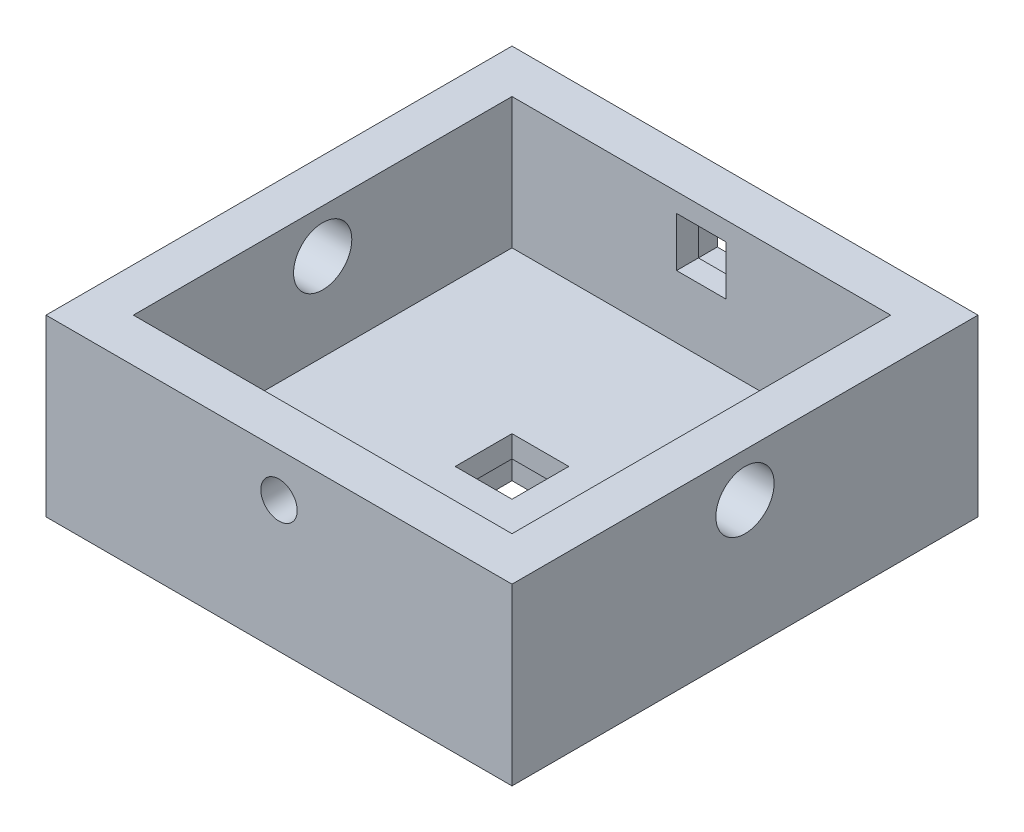
ISO-10303-21;
HEADER;
FILE_DESCRIPTION(('STEP AP214'),'2;1');
FILE_NAME('part.step','',(''),(''),'','','');
FILE_SCHEMA(('AUTOMOTIVE_DESIGN { 1 0 10303 214 1 1 1 1 }'));
ENDSEC;
DATA;
#1=APPLICATION_CONTEXT('core data for automotive mechanical design processes');
#2=APPLICATION_PROTOCOL_DEFINITION('international standard','automotive_design',2000,#1);
#3=PRODUCT_CONTEXT('',#1,'mechanical');
#4=PRODUCT('Part','Part','',(#3));
#5=PRODUCT_RELATED_PRODUCT_CATEGORY('part','',(#4));
#6=PRODUCT_DEFINITION_FORMATION('','',#4);
#7=PRODUCT_DEFINITION_CONTEXT('part definition',#1,'design');
#8=PRODUCT_DEFINITION('design','',#6,#7);
#9=PRODUCT_DEFINITION_SHAPE('','',#8);
#10=(LENGTH_UNIT() NAMED_UNIT(*) SI_UNIT(.MILLI.,.METRE.));
#11=(NAMED_UNIT(*) PLANE_ANGLE_UNIT() SI_UNIT($,.RADIAN.));
#12=(NAMED_UNIT(*) SI_UNIT($,.STERADIAN.) SOLID_ANGLE_UNIT());
#13=UNCERTAINTY_MEASURE_WITH_UNIT(LENGTH_MEASURE(1.E-05),#10,'distance_accuracy_value','');
#14=(GEOMETRIC_REPRESENTATION_CONTEXT(3) GLOBAL_UNCERTAINTY_ASSIGNED_CONTEXT((#13)) GLOBAL_UNIT_ASSIGNED_CONTEXT((#10,
#11,#12)) REPRESENTATION_CONTEXT('',''));
#15=CARTESIAN_POINT('',(0.,0.,0.));
#16=DIRECTION('',(0.,0.,1.));
#17=DIRECTION('',(1.,0.,0.));
#18=AXIS2_PLACEMENT_3D('',#15,#16,#17);
#19=CARTESIAN_POINT('',(0.,12.,-16.));
#20=DIRECTION('',(0.,0.,-1.));
#21=DIRECTION('',(-1.,0.,0.));
#22=AXIS2_PLACEMENT_3D('',#19,#20,#21);
#23=PLANE('',#22);
#24=DIRECTION('',(1.,0.,0.));
#25=VECTOR('',#24,1.);
#26=CARTESIAN_POINT('',(0.,0.,-16.));
#27=LINE('',#26,#25);
#28=CARTESIAN_POINT('',(-16.,0.,-16.));
#29=VERTEX_POINT('',#28);
#30=CARTESIAN_POINT('',(16.,0.,-16.));
#31=VERTEX_POINT('',#30);
#32=EDGE_CURVE('E380',#29,#31,#27,.T.);
#33=ORIENTED_EDGE('',*,*,#32,.F.);
#34=DIRECTION('',(0.,-1.,0.));
#35=VECTOR('',#34,1.);
#36=CARTESIAN_POINT('',(-16.,12.,-16.));
#37=LINE('',#36,#35);
#38=CARTESIAN_POINT('',(-16.,12.,-16.));
#39=VERTEX_POINT('',#38);
#40=EDGE_CURVE('E405',#39,#29,#37,.T.);
#41=ORIENTED_EDGE('',*,*,#40,.F.);
#42=DIRECTION('',(1.,0.,0.));
#43=VECTOR('',#42,1.);
#44=CARTESIAN_POINT('',(0.,12.,-16.));
#45=LINE('',#44,#43);
#46=CARTESIAN_POINT('',(16.,12.,-16.));
#47=VERTEX_POINT('',#46);
#48=EDGE_CURVE('E386',#39,#47,#45,.T.);
#49=ORIENTED_EDGE('',*,*,#48,.T.);
#50=DIRECTION('',(0.,-1.,0.));
#51=VECTOR('',#50,1.);
#52=CARTESIAN_POINT('',(16.,12.,-16.));
#53=LINE('',#52,#51);
#54=EDGE_CURVE('E439',#47,#31,#53,.T.);
#55=ORIENTED_EDGE('',*,*,#54,.T.);
#56=EDGE_LOOP('',(#33,#41,#49,#55));
#57=FACE_BOUND('',#56,.T.);
#58=DIRECTION('',(-1.,0.,0.));
#59=VECTOR('',#58,1.);
#60=CARTESIAN_POINT('',(1.9,7.1,-16.));
#61=LINE('',#60,#59);
#62=CARTESIAN_POINT('',(1.9,7.1,-16.));
#63=VERTEX_POINT('',#62);
#64=CARTESIAN_POINT('',(-1.9,7.1,-16.));
#65=VERTEX_POINT('',#64);
#66=EDGE_CURVE('E223',#63,#65,#61,.T.);
#67=ORIENTED_EDGE('',*,*,#66,.F.);
#68=DIRECTION('',(0.,1.,0.));
#69=VECTOR('',#68,1.);
#70=CARTESIAN_POINT('',(1.9,7.1,-16.));
#71=LINE('',#70,#69);
#72=CARTESIAN_POINT('',(1.9,10.9,-16.));
#73=VERTEX_POINT('',#72);
#74=EDGE_CURVE('E60',#63,#73,#71,.T.);
#75=ORIENTED_EDGE('',*,*,#74,.T.);
#76=DIRECTION('',(-1.,0.,0.));
#77=VECTOR('',#76,1.);
#78=CARTESIAN_POINT('',(1.9,10.9,-16.));
#79=LINE('',#78,#77);
#80=CARTESIAN_POINT('',(-1.9,10.9,-16.));
#81=VERTEX_POINT('',#80);
#82=EDGE_CURVE('E227',#73,#81,#79,.T.);
#83=ORIENTED_EDGE('',*,*,#82,.T.);
#84=DIRECTION('',(0.,1.,0.));
#85=VECTOR('',#84,1.);
#86=CARTESIAN_POINT('',(-1.9,7.1,-16.));
#87=LINE('',#86,#85);
#88=EDGE_CURVE('E842',#65,#81,#87,.T.);
#89=ORIENTED_EDGE('',*,*,#88,.F.);
#90=EDGE_LOOP('',(#67,#75,#83,#89));
#91=FACE_BOUND('',#90,.T.);
#92=ADVANCED_FACE('F44',(#57,#91),#23,.T.);
#93=CARTESIAN_POINT('',(0.,12.,-13.));
#94=DIRECTION('',(0.,0.,-1.));
#95=DIRECTION('',(-1.,0.,0.));
#96=AXIS2_PLACEMENT_3D('',#93,#94,#95);
#97=PLANE('',#96);
#98=DIRECTION('',(1.,0.,0.));
#99=VECTOR('',#98,1.);
#100=CARTESIAN_POINT('',(-13.,3.,-13.));
#101=LINE('',#100,#99);
#102=CARTESIAN_POINT('',(-13.,3.,-13.));
#103=VERTEX_POINT('',#102);
#104=CARTESIAN_POINT('',(13.,3.,-13.));
#105=VERTEX_POINT('',#104);
#106=EDGE_CURVE('E453',#103,#105,#101,.T.);
#107=ORIENTED_EDGE('',*,*,#106,.T.);
#108=DIRECTION('',(0.,-1.,0.));
#109=VECTOR('',#108,1.);
#110=CARTESIAN_POINT('',(13.,12.,-13.));
#111=LINE('',#110,#109);
#112=CARTESIAN_POINT('',(13.,12.,-13.));
#113=VERTEX_POINT('',#112);
#114=EDGE_CURVE('E419',#113,#105,#111,.T.);
#115=ORIENTED_EDGE('',*,*,#114,.F.);
#116=DIRECTION('',(1.,0.,0.));
#117=VECTOR('',#116,1.);
#118=CARTESIAN_POINT('',(0.,12.,-13.));
#119=LINE('',#118,#117);
#120=CARTESIAN_POINT('',(-13.,12.,-13.));
#121=VERTEX_POINT('',#120);
#122=EDGE_CURVE('E402',#121,#113,#119,.T.);
#123=ORIENTED_EDGE('',*,*,#122,.F.);
#124=DIRECTION('',(0.,-1.,0.));
#125=VECTOR('',#124,1.);
#126=CARTESIAN_POINT('',(-13.,12.,-13.));
#127=LINE('',#126,#125);
#128=EDGE_CURVE('E423',#121,#103,#127,.T.);
#129=ORIENTED_EDGE('',*,*,#128,.T.);
#130=EDGE_LOOP('',(#107,#115,#123,#129));
#131=FACE_BOUND('',#130,.T.);
#132=DIRECTION('',(0.,1.,0.));
#133=VECTOR('',#132,1.);
#134=CARTESIAN_POINT('',(1.7,7.3,-13.));
#135=LINE('',#134,#133);
#136=CARTESIAN_POINT('',(1.7,7.3,-13.));
#137=VERTEX_POINT('',#136);
#138=CARTESIAN_POINT('',(1.7,10.7,-13.));
#139=VERTEX_POINT('',#138);
#140=EDGE_CURVE('E244',#137,#139,#135,.T.);
#141=ORIENTED_EDGE('',*,*,#140,.F.);
#142=DIRECTION('',(-1.,0.,0.));
#143=VECTOR('',#142,1.);
#144=CARTESIAN_POINT('',(1.7,7.3,-13.));
#145=LINE('',#144,#143);
#146=CARTESIAN_POINT('',(-1.7,7.3,-13.));
#147=VERTEX_POINT('',#146);
#148=EDGE_CURVE('E254',#137,#147,#145,.T.);
#149=ORIENTED_EDGE('',*,*,#148,.T.);
#150=DIRECTION('',(0.,1.,0.));
#151=VECTOR('',#150,1.);
#152=CARTESIAN_POINT('',(-1.7,7.3,-13.));
#153=LINE('',#152,#151);
#154=CARTESIAN_POINT('',(-1.7,10.7,-13.));
#155=VERTEX_POINT('',#154);
#156=EDGE_CURVE('E250',#147,#155,#153,.T.);
#157=ORIENTED_EDGE('',*,*,#156,.T.);
#158=DIRECTION('',(-1.,0.,0.));
#159=VECTOR('',#158,1.);
#160=CARTESIAN_POINT('',(1.7,10.7,-13.));
#161=LINE('',#160,#159);
#162=EDGE_CURVE('E247',#139,#155,#161,.T.);
#163=ORIENTED_EDGE('',*,*,#162,.F.);
#164=EDGE_LOOP('',(#141,#149,#157,#163));
#165=FACE_BOUND('',#164,.T.);
#166=ADVANCED_FACE('F489',(#131,#165),#97,.F.);
#167=CARTESIAN_POINT('',(-1.95,3.,1.95));
#168=DIRECTION('',(-1.,0.,0.));
#169=DIRECTION('',(0.,0.,1.));
#170=AXIS2_PLACEMENT_3D('',#167,#168,#169);
#171=PLANE('',#170);
#172=DIRECTION('',(0.,0.,1.));
#173=VECTOR('',#172,1.);
#174=CARTESIAN_POINT('',(-1.95,1.5,1.95));
#175=LINE('',#174,#173);
#176=CARTESIAN_POINT('',(-1.95,1.5,-1.95));
#177=VERTEX_POINT('',#176);
#178=CARTESIAN_POINT('',(-1.95,1.5,1.95));
#179=VERTEX_POINT('',#178);
#180=EDGE_CURVE('E340',#177,#179,#175,.T.);
#181=ORIENTED_EDGE('',*,*,#180,.F.);
#182=DIRECTION('',(0.,-1.,0.));
#183=VECTOR('',#182,1.);
#184=CARTESIAN_POINT('',(-1.95,3.,-1.95));
#185=LINE('',#184,#183);
#186=CARTESIAN_POINT('',(-1.95,3.,-1.95));
#187=VERTEX_POINT('',#186);
#188=EDGE_CURVE('E358',#187,#177,#185,.T.);
#189=ORIENTED_EDGE('',*,*,#188,.F.);
#190=DIRECTION('',(0.,0.,-1.));
#191=VECTOR('',#190,1.);
#192=CARTESIAN_POINT('',(-1.95,3.,1.95));
#193=LINE('',#192,#191);
#194=CARTESIAN_POINT('',(-1.95,3.,1.95));
#195=VERTEX_POINT('',#194);
#196=EDGE_CURVE('E343',#195,#187,#193,.T.);
#197=ORIENTED_EDGE('',*,*,#196,.F.);
#198=DIRECTION('',(0.,-1.,0.));
#199=VECTOR('',#198,1.);
#200=CARTESIAN_POINT('',(-1.95,3.,1.95));
#201=LINE('',#200,#199);
#202=EDGE_CURVE('E359',#195,#179,#201,.T.);
#203=ORIENTED_EDGE('',*,*,#202,.T.);
#204=EDGE_LOOP('',(#181,#189,#197,#203));
#205=FACE_BOUND('',#204,.T.);
#206=ADVANCED_FACE('F467',(#205),#171,.F.);
#207=CARTESIAN_POINT('',(-1.95,3.,1.95));
#208=DIRECTION('',(0.,0.,-1.));
#209=DIRECTION('',(-1.,0.,0.));
#210=AXIS2_PLACEMENT_3D('',#207,#208,#209);
#211=PLANE('',#210);
#212=DIRECTION('',(0.,-1.,0.));
#213=VECTOR('',#212,1.);
#214=CARTESIAN_POINT('',(1.95,3.,1.95));
#215=LINE('',#214,#213);
#216=CARTESIAN_POINT('',(1.95,3.,1.95));
#217=VERTEX_POINT('',#216);
#218=CARTESIAN_POINT('',(1.95,1.5,1.95));
#219=VERTEX_POINT('',#218);
#220=EDGE_CURVE('E364',#217,#219,#215,.T.);
#221=ORIENTED_EDGE('',*,*,#220,.T.);
#222=DIRECTION('',(-1.,0.,0.));
#223=VECTOR('',#222,1.);
#224=CARTESIAN_POINT('',(-1.95,1.5,1.95));
#225=LINE('',#224,#223);
#226=EDGE_CURVE('E336',#219,#179,#225,.T.);
#227=ORIENTED_EDGE('',*,*,#226,.T.);
#228=ORIENTED_EDGE('',*,*,#202,.F.);
#229=DIRECTION('',(1.,0.,0.));
#230=VECTOR('',#229,1.);
#231=CARTESIAN_POINT('',(-1.95,3.,1.95));
#232=LINE('',#231,#230);
#233=EDGE_CURVE('E355',#195,#217,#232,.T.);
#234=ORIENTED_EDGE('',*,*,#233,.T.);
#235=EDGE_LOOP('',(#221,#227,#228,#234));
#236=FACE_BOUND('',#235,.T.);
#237=ADVANCED_FACE('F477',(#236),#211,.T.);
#238=CARTESIAN_POINT('',(1.95,3.,1.95));
#239=DIRECTION('',(-1.,0.,0.));
#240=DIRECTION('',(0.,0.,1.));
#241=AXIS2_PLACEMENT_3D('',#238,#239,#240);
#242=PLANE('',#241);
#243=DIRECTION('',(0.,-1.,0.));
#244=VECTOR('',#243,1.);
#245=CARTESIAN_POINT('',(1.95,3.,-1.95));
#246=LINE('',#245,#244);
#247=CARTESIAN_POINT('',(1.95,3.,-1.95));
#248=VERTEX_POINT('',#247);
#249=CARTESIAN_POINT('',(1.95,1.5,-1.95));
#250=VERTEX_POINT('',#249);
#251=EDGE_CURVE('E368',#248,#250,#246,.T.);
#252=ORIENTED_EDGE('',*,*,#251,.T.);
#253=DIRECTION('',(0.,0.,1.));
#254=VECTOR('',#253,1.);
#255=CARTESIAN_POINT('',(1.95,1.5,1.95));
#256=LINE('',#255,#254);
#257=EDGE_CURVE('E323',#250,#219,#256,.T.);
#258=ORIENTED_EDGE('',*,*,#257,.T.);
#259=ORIENTED_EDGE('',*,*,#220,.F.);
#260=DIRECTION('',(0.,0.,-1.));
#261=VECTOR('',#260,1.);
#262=CARTESIAN_POINT('',(1.95,3.,1.95));
#263=LINE('',#262,#261);
#264=EDGE_CURVE('E351',#217,#248,#263,.T.);
#265=ORIENTED_EDGE('',*,*,#264,.T.);
#266=EDGE_LOOP('',(#252,#258,#259,#265));
#267=FACE_BOUND('',#266,.T.);
#268=ADVANCED_FACE('F479',(#267),#242,.T.);
#269=CARTESIAN_POINT('',(-1.95,3.,-1.95));
#270=DIRECTION('',(0.,0.,-1.));
#271=DIRECTION('',(-1.,0.,0.));
#272=AXIS2_PLACEMENT_3D('',#269,#270,#271);
#273=PLANE('',#272);
#274=DIRECTION('',(-1.,0.,0.));
#275=VECTOR('',#274,1.);
#276=CARTESIAN_POINT('',(-1.95,1.5,-1.95));
#277=LINE('',#276,#275);
#278=EDGE_CURVE('E53',#250,#177,#277,.T.);
#279=ORIENTED_EDGE('',*,*,#278,.F.);
#280=ORIENTED_EDGE('',*,*,#251,.F.);
#281=DIRECTION('',(1.,0.,0.));
#282=VECTOR('',#281,1.);
#283=CARTESIAN_POINT('',(-1.95,3.,-1.95));
#284=LINE('',#283,#282);
#285=EDGE_CURVE('E347',#187,#248,#284,.T.);
#286=ORIENTED_EDGE('',*,*,#285,.F.);
#287=ORIENTED_EDGE('',*,*,#188,.T.);
#288=EDGE_LOOP('',(#279,#280,#286,#287));
#289=FACE_BOUND('',#288,.T.);
#290=ADVANCED_FACE('F470',(#289),#273,.F.);
#291=CARTESIAN_POINT('',(0.,3.,0.));
#292=DIRECTION('',(0.,1.,0.));
#293=DIRECTION('',(0.,0.,1.));
#294=AXIS2_PLACEMENT_3D('',#291,#292,#293);
#295=PLANE('',#294);
#296=DIRECTION('',(1.,0.,0.));
#297=VECTOR('',#296,1.);
#298=CARTESIAN_POINT('',(-13.,3.,13.));
#299=LINE('',#298,#297);
#300=CARTESIAN_POINT('',(-13.,3.,13.));
#301=VERTEX_POINT('',#300);
#302=CARTESIAN_POINT('',(13.,3.,13.));
#303=VERTEX_POINT('',#302);
#304=EDGE_CURVE('E436',#301,#303,#299,.T.);
#305=ORIENTED_EDGE('',*,*,#304,.T.);
#306=DIRECTION('',(0.,0.,-1.));
#307=VECTOR('',#306,1.);
#308=CARTESIAN_POINT('',(13.,3.,13.));
#309=LINE('',#308,#307);
#310=EDGE_CURVE('E450',#303,#105,#309,.T.);
#311=ORIENTED_EDGE('',*,*,#310,.T.);
#312=ORIENTED_EDGE('',*,*,#106,.F.);
#313=DIRECTION('',(0.,0.,-1.));
#314=VECTOR('',#313,1.);
#315=CARTESIAN_POINT('',(-13.,3.,13.));
#316=LINE('',#315,#314);
#317=EDGE_CURVE('E457',#301,#103,#316,.T.);
#318=ORIENTED_EDGE('',*,*,#317,.F.);
#319=EDGE_LOOP('',(#305,#311,#312,#318));
#320=FACE_BOUND('',#319,.T.);
#321=ORIENTED_EDGE('',*,*,#233,.F.);
#322=ORIENTED_EDGE('',*,*,#196,.T.);
#323=ORIENTED_EDGE('',*,*,#285,.T.);
#324=ORIENTED_EDGE('',*,*,#264,.F.);
#325=EDGE_LOOP('',(#321,#322,#323,#324));
#326=FACE_BOUND('',#325,.T.);
#327=ADVANCED_FACE('F474',(#320,#326),#295,.T.);
#328=CARTESIAN_POINT('',(13.,12.,0.));
#329=DIRECTION('',(-1.,0.,0.));
#330=DIRECTION('',(0.,0.,1.));
#331=AXIS2_PLACEMENT_3D('',#328,#329,#330);
#332=PLANE('',#331);
#333=CARTESIAN_POINT('',(13.,9.,0.));
#334=DIRECTION('',(-1.,0.,0.));
#335=DIRECTION('',(0.,0.,1.));
#336=AXIS2_PLACEMENT_3D('',#333,#334,#335);
#337=CIRCLE('',#336,2.);
#338=CARTESIAN_POINT('',(13.,9.,2.));
#339=VERTEX_POINT('',#338);
#340=EDGE_CURVE('E286',#339,#339,#337,.T.);
#341=ORIENTED_EDGE('',*,*,#340,.F.);
#342=EDGE_LOOP('',(#341));
#343=FACE_BOUND('',#342,.T.);
#344=ORIENTED_EDGE('',*,*,#114,.T.);
#345=ORIENTED_EDGE('',*,*,#310,.F.);
#346=DIRECTION('',(0.,-1.,0.));
#347=VECTOR('',#346,1.);
#348=CARTESIAN_POINT('',(13.,12.,13.));
#349=LINE('',#348,#347);
#350=CARTESIAN_POINT('',(13.,12.,13.));
#351=VERTEX_POINT('',#350);
#352=EDGE_CURVE('E432',#351,#303,#349,.T.);
#353=ORIENTED_EDGE('',*,*,#352,.F.);
#354=DIRECTION('',(0.,0.,-1.));
#355=VECTOR('',#354,1.);
#356=CARTESIAN_POINT('',(13.,12.,0.));
#357=LINE('',#356,#355);
#358=EDGE_CURVE('E390',#351,#113,#357,.T.);
#359=ORIENTED_EDGE('',*,*,#358,.T.);
#360=EDGE_LOOP('',(#344,#345,#353,#359));
#361=FACE_BOUND('',#360,.T.);
#362=ADVANCED_FACE('F501',(#343,#361),#332,.T.);
#363=CARTESIAN_POINT('',(0.,12.,13.));
#364=DIRECTION('',(0.,0.,-1.));
#365=DIRECTION('',(-1.,0.,0.));
#366=AXIS2_PLACEMENT_3D('',#363,#364,#365);
#367=PLANE('',#366);
#368=CARTESIAN_POINT('',(0.,9.,13.));
#369=DIRECTION('',(0.,0.,1.));
#370=DIRECTION('',(1.,0.,0.));
#371=AXIS2_PLACEMENT_3D('',#368,#369,#370);
#372=CIRCLE('',#371,1.25);
#373=CARTESIAN_POINT('',(1.25,9.,13.));
#374=VERTEX_POINT('',#373);
#375=EDGE_CURVE('E824',#374,#374,#372,.T.);
#376=ORIENTED_EDGE('',*,*,#375,.T.);
#377=EDGE_LOOP('',(#376));
#378=FACE_BOUND('',#377,.T.);
#379=ORIENTED_EDGE('',*,*,#352,.T.);
#380=ORIENTED_EDGE('',*,*,#304,.F.);
#381=DIRECTION('',(0.,-1.,0.));
#382=VECTOR('',#381,1.);
#383=CARTESIAN_POINT('',(-13.,12.,13.));
#384=LINE('',#383,#382);
#385=CARTESIAN_POINT('',(-13.,12.,13.));
#386=VERTEX_POINT('',#385);
#387=EDGE_CURVE('E428',#386,#301,#384,.T.);
#388=ORIENTED_EDGE('',*,*,#387,.F.);
#389=DIRECTION('',(1.,0.,0.));
#390=VECTOR('',#389,1.);
#391=CARTESIAN_POINT('',(0.,12.,13.));
#392=LINE('',#391,#390);
#393=EDGE_CURVE('E394',#386,#351,#392,.T.);
#394=ORIENTED_EDGE('',*,*,#393,.T.);
#395=EDGE_LOOP('',(#379,#380,#388,#394));
#396=FACE_BOUND('',#395,.T.);
#397=ADVANCED_FACE('F521',(#378,#396),#367,.T.);
#398=CARTESIAN_POINT('',(-13.,12.,0.));
#399=DIRECTION('',(-1.,0.,0.));
#400=DIRECTION('',(0.,0.,1.));
#401=AXIS2_PLACEMENT_3D('',#398,#399,#400);
#402=PLANE('',#401);
#403=CARTESIAN_POINT('',(-13.,9.,0.));
#404=DIRECTION('',(-1.,0.,0.));
#405=DIRECTION('',(0.,0.,1.));
#406=AXIS2_PLACEMENT_3D('',#403,#404,#405);
#407=CIRCLE('',#406,2.);
#408=CARTESIAN_POINT('',(-13.,9.,2.));
#409=VERTEX_POINT('',#408);
#410=EDGE_CURVE('E279',#409,#409,#407,.T.);
#411=ORIENTED_EDGE('',*,*,#410,.T.);
#412=EDGE_LOOP('',(#411));
#413=FACE_BOUND('',#412,.T.);
#414=ORIENTED_EDGE('',*,*,#317,.T.);
#415=ORIENTED_EDGE('',*,*,#128,.F.);
#416=DIRECTION('',(0.,0.,-1.));
#417=VECTOR('',#416,1.);
#418=CARTESIAN_POINT('',(-13.,12.,0.));
#419=LINE('',#418,#417);
#420=EDGE_CURVE('E398',#386,#121,#419,.T.);
#421=ORIENTED_EDGE('',*,*,#420,.F.);
#422=ORIENTED_EDGE('',*,*,#387,.T.);
#423=EDGE_LOOP('',(#414,#415,#421,#422));
#424=FACE_BOUND('',#423,.T.);
#425=ADVANCED_FACE('F514',(#413,#424),#402,.F.);
#426=CARTESIAN_POINT('',(-16.,12.,0.));
#427=DIRECTION('',(-1.,0.,0.));
#428=DIRECTION('',(0.,0.,1.));
#429=AXIS2_PLACEMENT_3D('',#426,#427,#428);
#430=PLANE('',#429);
#431=CARTESIAN_POINT('',(-16.,9.,0.));
#432=DIRECTION('',(1.,0.,0.));
#433=DIRECTION('',(0.,0.,-1.));
#434=AXIS2_PLACEMENT_3D('',#431,#432,#433);
#435=CIRCLE('',#434,2.);
#436=CARTESIAN_POINT('',(-16.,9.,-2.));
#437=VERTEX_POINT('',#436);
#438=EDGE_CURVE('E275',#437,#437,#435,.T.);
#439=ORIENTED_EDGE('',*,*,#438,.T.);
#440=EDGE_LOOP('',(#439));
#441=FACE_BOUND('',#440,.T.);
#442=DIRECTION('',(0.,0.,-1.));
#443=VECTOR('',#442,1.);
#444=CARTESIAN_POINT('',(-16.,0.,0.));
#445=LINE('',#444,#443);
#446=CARTESIAN_POINT('',(-16.,0.,16.));
#447=VERTEX_POINT('',#446);
#448=EDGE_CURVE('E363',#447,#29,#445,.T.);
#449=ORIENTED_EDGE('',*,*,#448,.F.);
#450=DIRECTION('',(0.,-1.,0.));
#451=VECTOR('',#450,1.);
#452=CARTESIAN_POINT('',(-16.,12.,16.));
#453=LINE('',#452,#451);
#454=CARTESIAN_POINT('',(-16.,12.,16.));
#455=VERTEX_POINT('',#454);
#456=EDGE_CURVE('E424',#455,#447,#453,.T.);
#457=ORIENTED_EDGE('',*,*,#456,.F.);
#458=DIRECTION('',(0.,0.,-1.));
#459=VECTOR('',#458,1.);
#460=CARTESIAN_POINT('',(-16.,12.,0.));
#461=LINE('',#460,#459);
#462=EDGE_CURVE('E375',#455,#39,#461,.T.);
#463=ORIENTED_EDGE('',*,*,#462,.T.);
#464=ORIENTED_EDGE('',*,*,#40,.T.);
#465=EDGE_LOOP('',(#449,#457,#463,#464));
#466=FACE_BOUND('',#465,.T.);
#467=ADVANCED_FACE('F511',(#441,#466),#430,.T.);
#468=CARTESIAN_POINT('',(0.,12.,16.));
#469=DIRECTION('',(0.,0.,-1.));
#470=DIRECTION('',(-1.,0.,0.));
#471=AXIS2_PLACEMENT_3D('',#468,#469,#470);
#472=PLANE('',#471);
#473=CARTESIAN_POINT('',(0.,9.,16.));
#474=DIRECTION('',(0.,0.,1.));
#475=DIRECTION('',(1.,0.,0.));
#476=AXIS2_PLACEMENT_3D('',#473,#474,#475);
#477=CIRCLE('',#476,1.25);
#478=CARTESIAN_POINT('',(1.25,9.,16.));
#479=VERTEX_POINT('',#478);
#480=EDGE_CURVE('E827',#479,#479,#477,.T.);
#481=ORIENTED_EDGE('',*,*,#480,.F.);
#482=EDGE_LOOP('',(#481));
#483=FACE_BOUND('',#482,.T.);
#484=DIRECTION('',(1.,0.,0.));
#485=VECTOR('',#484,1.);
#486=CARTESIAN_POINT('',(0.,0.,16.));
#487=LINE('',#486,#485);
#488=CARTESIAN_POINT('',(16.,0.,16.));
#489=VERTEX_POINT('',#488);
#490=EDGE_CURVE('E409',#447,#489,#487,.T.);
#491=ORIENTED_EDGE('',*,*,#490,.T.);
#492=DIRECTION('',(0.,-1.,0.));
#493=VECTOR('',#492,1.);
#494=CARTESIAN_POINT('',(16.,12.,16.));
#495=LINE('',#494,#493);
#496=CARTESIAN_POINT('',(16.,12.,16.));
#497=VERTEX_POINT('',#496);
#498=EDGE_CURVE('E442',#497,#489,#495,.T.);
#499=ORIENTED_EDGE('',*,*,#498,.F.);
#500=DIRECTION('',(1.,0.,0.));
#501=VECTOR('',#500,1.);
#502=CARTESIAN_POINT('',(0.,12.,16.));
#503=LINE('',#502,#501);
#504=EDGE_CURVE('E379',#455,#497,#503,.T.);
#505=ORIENTED_EDGE('',*,*,#504,.F.);
#506=ORIENTED_EDGE('',*,*,#456,.T.);
#507=EDGE_LOOP('',(#491,#499,#505,#506));
#508=FACE_BOUND('',#507,.T.);
#509=ADVANCED_FACE('F507',(#483,#508),#472,.F.);
#510=CARTESIAN_POINT('',(16.,12.,0.));
#511=DIRECTION('',(-1.,0.,0.));
#512=DIRECTION('',(0.,0.,1.));
#513=AXIS2_PLACEMENT_3D('',#510,#511,#512);
#514=PLANE('',#513);
#515=CARTESIAN_POINT('',(16.,9.,0.));
#516=DIRECTION('',(1.,0.,0.));
#517=DIRECTION('',(0.,0.,-1.));
#518=AXIS2_PLACEMENT_3D('',#515,#516,#517);
#519=CIRCLE('',#518,2.);
#520=CARTESIAN_POINT('',(16.,9.,-2.));
#521=VERTEX_POINT('',#520);
#522=EDGE_CURVE('E274',#521,#521,#519,.T.);
#523=ORIENTED_EDGE('',*,*,#522,.F.);
#524=EDGE_LOOP('',(#523));
#525=FACE_BOUND('',#524,.T.);
#526=DIRECTION('',(0.,0.,-1.));
#527=VECTOR('',#526,1.);
#528=CARTESIAN_POINT('',(16.,0.,0.));
#529=LINE('',#528,#527);
#530=EDGE_CURVE('E412',#489,#31,#529,.T.);
#531=ORIENTED_EDGE('',*,*,#530,.T.);
#532=ORIENTED_EDGE('',*,*,#54,.F.);
#533=DIRECTION('',(0.,0.,-1.));
#534=VECTOR('',#533,1.);
#535=CARTESIAN_POINT('',(16.,12.,0.));
#536=LINE('',#535,#534);
#537=EDGE_CURVE('E383',#497,#47,#536,.T.);
#538=ORIENTED_EDGE('',*,*,#537,.F.);
#539=ORIENTED_EDGE('',*,*,#498,.T.);
#540=EDGE_LOOP('',(#531,#532,#538,#539));
#541=FACE_BOUND('',#540,.T.);
#542=ADVANCED_FACE('F503',(#525,#541),#514,.F.);
#543=CARTESIAN_POINT('',(0.,12.,0.));
#544=DIRECTION('',(0.,1.,0.));
#545=DIRECTION('',(0.,0.,1.));
#546=AXIS2_PLACEMENT_3D('',#543,#544,#545);
#547=PLANE('',#546);
#548=ORIENTED_EDGE('',*,*,#462,.F.);
#549=ORIENTED_EDGE('',*,*,#504,.T.);
#550=ORIENTED_EDGE('',*,*,#537,.T.);
#551=ORIENTED_EDGE('',*,*,#48,.F.);
#552=EDGE_LOOP('',(#548,#549,#550,#551));
#553=FACE_BOUND('',#552,.T.);
#554=ORIENTED_EDGE('',*,*,#358,.F.);
#555=ORIENTED_EDGE('',*,*,#393,.F.);
#556=ORIENTED_EDGE('',*,*,#420,.T.);
#557=ORIENTED_EDGE('',*,*,#122,.T.);
#558=EDGE_LOOP('',(#554,#555,#556,#557));
#559=FACE_BOUND('',#558,.T.);
#560=ADVANCED_FACE('F506',(#553,#559),#547,.T.);
#561=CARTESIAN_POINT('',(0.,0.,0.));
#562=DIRECTION('',(0.,1.,0.));
#563=DIRECTION('',(0.,0.,1.));
#564=AXIS2_PLACEMENT_3D('',#561,#562,#563);
#565=PLANE('',#564);
#566=DIRECTION('',(1.,0.,0.));
#567=VECTOR('',#566,1.);
#568=CARTESIAN_POINT('',(-2.15,0.,-2.15));
#569=LINE('',#568,#567);
#570=CARTESIAN_POINT('',(-2.15,0.,-2.15));
#571=VERTEX_POINT('',#570);
#572=CARTESIAN_POINT('',(2.15,0.,-2.15));
#573=VERTEX_POINT('',#572);
#574=EDGE_CURVE('E309',#571,#573,#569,.T.);
#575=ORIENTED_EDGE('',*,*,#574,.F.);
#576=DIRECTION('',(0.,0.,-1.));
#577=VECTOR('',#576,1.);
#578=CARTESIAN_POINT('',(-2.15,0.,2.15));
#579=LINE('',#578,#577);
#580=CARTESIAN_POINT('',(-2.15,0.,2.15));
#581=VERTEX_POINT('',#580);
#582=EDGE_CURVE('E290',#581,#571,#579,.T.);
#583=ORIENTED_EDGE('',*,*,#582,.F.);
#584=DIRECTION('',(1.,0.,0.));
#585=VECTOR('',#584,1.);
#586=CARTESIAN_POINT('',(-2.15,0.,2.15));
#587=LINE('',#586,#585);
#588=CARTESIAN_POINT('',(2.15,0.,2.15));
#589=VERTEX_POINT('',#588);
#590=EDGE_CURVE('E296',#581,#589,#587,.T.);
#591=ORIENTED_EDGE('',*,*,#590,.T.);
#592=DIRECTION('',(0.,0.,-1.));
#593=VECTOR('',#592,1.);
#594=CARTESIAN_POINT('',(2.15,0.,2.15));
#595=LINE('',#594,#593);
#596=EDGE_CURVE('E313',#589,#573,#595,.T.);
#597=ORIENTED_EDGE('',*,*,#596,.T.);
#598=EDGE_LOOP('',(#575,#583,#591,#597));
#599=FACE_BOUND('',#598,.T.);
#600=ORIENTED_EDGE('',*,*,#448,.T.);
#601=ORIENTED_EDGE('',*,*,#32,.T.);
#602=ORIENTED_EDGE('',*,*,#530,.F.);
#603=ORIENTED_EDGE('',*,*,#490,.F.);
#604=EDGE_LOOP('',(#600,#601,#602,#603));
#605=FACE_BOUND('',#604,.T.);
#606=ADVANCED_FACE('F46',(#599,#605),#565,.F.);
#607=CARTESIAN_POINT('',(0.,1.5,0.));
#608=DIRECTION('',(0.,-1.,0.));
#609=DIRECTION('',(0.,0.,-1.));
#610=AXIS2_PLACEMENT_3D('',#607,#608,#609);
#611=PLANE('',#610);
#612=DIRECTION('',(0.,0.,-1.));
#613=VECTOR('',#612,1.);
#614=CARTESIAN_POINT('',(-2.15,1.5,2.15));
#615=LINE('',#614,#613);
#616=CARTESIAN_POINT('',(-2.15,1.5,2.15));
#617=VERTEX_POINT('',#616);
#618=CARTESIAN_POINT('',(-2.15,1.5,-2.15));
#619=VERTEX_POINT('',#618);
#620=EDGE_CURVE('E291',#617,#619,#615,.T.);
#621=ORIENTED_EDGE('',*,*,#620,.T.);
#622=DIRECTION('',(1.,0.,0.));
#623=VECTOR('',#622,1.);
#624=CARTESIAN_POINT('',(-2.15,1.5,-2.15));
#625=LINE('',#624,#623);
#626=CARTESIAN_POINT('',(2.15,1.5,-2.15));
#627=VERTEX_POINT('',#626);
#628=EDGE_CURVE('E295',#619,#627,#625,.T.);
#629=ORIENTED_EDGE('',*,*,#628,.T.);
#630=DIRECTION('',(0.,0.,-1.));
#631=VECTOR('',#630,1.);
#632=CARTESIAN_POINT('',(2.15,1.5,2.15));
#633=LINE('',#632,#631);
#634=CARTESIAN_POINT('',(2.15,1.5,2.15));
#635=VERTEX_POINT('',#634);
#636=EDGE_CURVE('E300',#635,#627,#633,.T.);
#637=ORIENTED_EDGE('',*,*,#636,.F.);
#638=DIRECTION('',(1.,0.,0.));
#639=VECTOR('',#638,1.);
#640=CARTESIAN_POINT('',(-2.15,1.5,2.15));
#641=LINE('',#640,#639);
#642=EDGE_CURVE('E303',#617,#635,#641,.T.);
#643=ORIENTED_EDGE('',*,*,#642,.F.);
#644=EDGE_LOOP('',(#621,#629,#637,#643));
#645=FACE_BOUND('',#644,.T.);
#646=ORIENTED_EDGE('',*,*,#180,.T.);
#647=ORIENTED_EDGE('',*,*,#226,.F.);
#648=ORIENTED_EDGE('',*,*,#257,.F.);
#649=ORIENTED_EDGE('',*,*,#278,.T.);
#650=EDGE_LOOP('',(#646,#647,#648,#649));
#651=FACE_BOUND('',#650,.T.);
#652=ADVANCED_FACE('F464',(#645,#651),#611,.T.);
#653=CARTESIAN_POINT('',(-2.15,1.5,2.15));
#654=DIRECTION('',(-1.,0.,0.));
#655=DIRECTION('',(0.,0.,1.));
#656=AXIS2_PLACEMENT_3D('',#653,#654,#655);
#657=PLANE('',#656);
#658=ORIENTED_EDGE('',*,*,#582,.T.);
#659=DIRECTION('',(0.,-1.,0.));
#660=VECTOR('',#659,1.);
#661=CARTESIAN_POINT('',(-2.15,1.5,-2.15));
#662=LINE('',#661,#660);
#663=EDGE_CURVE('E306',#619,#571,#662,.T.);
#664=ORIENTED_EDGE('',*,*,#663,.F.);
#665=ORIENTED_EDGE('',*,*,#620,.F.);
#666=DIRECTION('',(0.,-1.,0.));
#667=VECTOR('',#666,1.);
#668=CARTESIAN_POINT('',(-2.15,1.5,2.15));
#669=LINE('',#668,#667);
#670=EDGE_CURVE('E320',#617,#581,#669,.T.);
#671=ORIENTED_EDGE('',*,*,#670,.T.);
#672=EDGE_LOOP('',(#658,#664,#665,#671));
#673=FACE_BOUND('',#672,.T.);
#674=ADVANCED_FACE('F586',(#673),#657,.F.);
#675=CARTESIAN_POINT('',(-2.15,1.5,2.15));
#676=DIRECTION('',(0.,0.,-1.));
#677=DIRECTION('',(-1.,0.,0.));
#678=AXIS2_PLACEMENT_3D('',#675,#676,#677);
#679=PLANE('',#678);
#680=ORIENTED_EDGE('',*,*,#590,.F.);
#681=ORIENTED_EDGE('',*,*,#670,.F.);
#682=ORIENTED_EDGE('',*,*,#642,.T.);
#683=DIRECTION('',(0.,-1.,0.));
#684=VECTOR('',#683,1.);
#685=CARTESIAN_POINT('',(2.15,1.5,2.15));
#686=LINE('',#685,#684);
#687=EDGE_CURVE('E324',#635,#589,#686,.T.);
#688=ORIENTED_EDGE('',*,*,#687,.T.);
#689=EDGE_LOOP('',(#680,#681,#682,#688));
#690=FACE_BOUND('',#689,.T.);
#691=ADVANCED_FACE('F598',(#690),#679,.T.);
#692=CARTESIAN_POINT('',(2.15,1.5,2.15));
#693=DIRECTION('',(-1.,0.,0.));
#694=DIRECTION('',(0.,0.,1.));
#695=AXIS2_PLACEMENT_3D('',#692,#693,#694);
#696=PLANE('',#695);
#697=ORIENTED_EDGE('',*,*,#596,.F.);
#698=ORIENTED_EDGE('',*,*,#687,.F.);
#699=ORIENTED_EDGE('',*,*,#636,.T.);
#700=DIRECTION('',(0.,-1.,0.));
#701=VECTOR('',#700,1.);
#702=CARTESIAN_POINT('',(2.15,1.5,-2.15));
#703=LINE('',#702,#701);
#704=EDGE_CURVE('E327',#627,#573,#703,.T.);
#705=ORIENTED_EDGE('',*,*,#704,.T.);
#706=EDGE_LOOP('',(#697,#698,#699,#705));
#707=FACE_BOUND('',#706,.T.);
#708=ADVANCED_FACE('F609',(#707),#696,.T.);
#709=CARTESIAN_POINT('',(-2.15,1.5,-2.15));
#710=DIRECTION('',(0.,0.,-1.));
#711=DIRECTION('',(-1.,0.,0.));
#712=AXIS2_PLACEMENT_3D('',#709,#710,#711);
#713=PLANE('',#712);
#714=ORIENTED_EDGE('',*,*,#574,.T.);
#715=ORIENTED_EDGE('',*,*,#704,.F.);
#716=ORIENTED_EDGE('',*,*,#628,.F.);
#717=ORIENTED_EDGE('',*,*,#663,.T.);
#718=EDGE_LOOP('',(#714,#715,#716,#717));
#719=FACE_BOUND('',#718,.T.);
#720=ADVANCED_FACE('F620',(#719),#713,.F.);
#721=CARTESIAN_POINT('',(-16.,9.,0.));
#722=DIRECTION('',(1.,0.,0.));
#723=DIRECTION('',(0.,0.,-1.));
#724=AXIS2_PLACEMENT_3D('',#721,#722,#723);
#725=CYLINDRICAL_SURFACE('',#724,2.);
#726=ORIENTED_EDGE('',*,*,#340,.T.);
#727=EDGE_LOOP('',(#726));
#728=FACE_BOUND('',#727,.T.);
#729=ORIENTED_EDGE('',*,*,#522,.T.);
#730=EDGE_LOOP('',(#729));
#731=FACE_BOUND('',#730,.T.);
#732=ADVANCED_FACE('F631',(#728,#731),#725,.F.);
#733=ORIENTED_EDGE('',*,*,#438,.F.);
#734=EDGE_LOOP('',(#733));
#735=FACE_BOUND('',#734,.T.);
#736=ORIENTED_EDGE('',*,*,#410,.F.);
#737=EDGE_LOOP('',(#736));
#738=FACE_BOUND('',#737,.T.);
#739=ADVANCED_FACE('F670',(#735,#738),#725,.F.);
#740=CARTESIAN_POINT('',(1.7,7.3,-13.));
#741=DIRECTION('',(-1.,0.,0.));
#742=DIRECTION('',(0.,0.,1.));
#743=AXIS2_PLACEMENT_3D('',#740,#741,#742);
#744=PLANE('',#743);
#745=DIRECTION('',(0.,1.,0.));
#746=VECTOR('',#745,1.);
#747=CARTESIAN_POINT('',(1.7,7.3,-14.5));
#748=LINE('',#747,#746);
#749=CARTESIAN_POINT('',(1.7,7.3,-14.5));
#750=VERTEX_POINT('',#749);
#751=CARTESIAN_POINT('',(1.7,10.7,-14.5));
#752=VERTEX_POINT('',#751);
#753=EDGE_CURVE('E241',#750,#752,#748,.T.);
#754=ORIENTED_EDGE('',*,*,#753,.F.);
#755=DIRECTION('',(0.,0.,-1.));
#756=VECTOR('',#755,1.);
#757=CARTESIAN_POINT('',(1.7,7.3,-13.));
#758=LINE('',#757,#756);
#759=EDGE_CURVE('E258',#137,#750,#758,.T.);
#760=ORIENTED_EDGE('',*,*,#759,.F.);
#761=ORIENTED_EDGE('',*,*,#140,.T.);
#762=DIRECTION('',(0.,0.,-1.));
#763=VECTOR('',#762,1.);
#764=CARTESIAN_POINT('',(1.7,10.7,-13.));
#765=LINE('',#764,#763);
#766=EDGE_CURVE('E270',#139,#752,#765,.T.);
#767=ORIENTED_EDGE('',*,*,#766,.T.);
#768=EDGE_LOOP('',(#754,#760,#761,#767));
#769=FACE_BOUND('',#768,.T.);
#770=ADVANCED_FACE('F680',(#769),#744,.T.);
#771=CARTESIAN_POINT('',(1.7,10.7,-13.));
#772=DIRECTION('',(0.,-1.,0.));
#773=DIRECTION('',(0.,0.,-1.));
#774=AXIS2_PLACEMENT_3D('',#771,#772,#773);
#775=PLANE('',#774);
#776=DIRECTION('',(-1.,0.,0.));
#777=VECTOR('',#776,1.);
#778=CARTESIAN_POINT('',(1.7,10.7,-14.5));
#779=LINE('',#778,#777);
#780=CARTESIAN_POINT('',(-1.7,10.7,-14.5));
#781=VERTEX_POINT('',#780);
#782=EDGE_CURVE('E233',#752,#781,#779,.T.);
#783=ORIENTED_EDGE('',*,*,#782,.F.);
#784=ORIENTED_EDGE('',*,*,#766,.F.);
#785=ORIENTED_EDGE('',*,*,#162,.T.);
#786=DIRECTION('',(0.,0.,-1.));
#787=VECTOR('',#786,1.);
#788=CARTESIAN_POINT('',(-1.7,10.7,-13.));
#789=LINE('',#788,#787);
#790=EDGE_CURVE('E266',#155,#781,#789,.T.);
#791=ORIENTED_EDGE('',*,*,#790,.T.);
#792=EDGE_LOOP('',(#783,#784,#785,#791));
#793=FACE_BOUND('',#792,.T.);
#794=ADVANCED_FACE('F703',(#793),#775,.T.);
#795=CARTESIAN_POINT('',(-1.7,7.3,-13.));
#796=DIRECTION('',(-1.,0.,0.));
#797=DIRECTION('',(0.,0.,1.));
#798=AXIS2_PLACEMENT_3D('',#795,#796,#797);
#799=PLANE('',#798);
#800=DIRECTION('',(0.,0.,-1.));
#801=VECTOR('',#800,1.);
#802=CARTESIAN_POINT('',(-1.7,7.3,-13.));
#803=LINE('',#802,#801);
#804=CARTESIAN_POINT('',(-1.7,7.3,-14.5));
#805=VERTEX_POINT('',#804);
#806=EDGE_CURVE('E262',#147,#805,#803,.T.);
#807=ORIENTED_EDGE('',*,*,#806,.T.);
#808=DIRECTION('',(0.,1.,0.));
#809=VECTOR('',#808,1.);
#810=CARTESIAN_POINT('',(-1.7,7.3,-14.5));
#811=LINE('',#810,#809);
#812=EDGE_CURVE('E68',#805,#781,#811,.T.);
#813=ORIENTED_EDGE('',*,*,#812,.T.);
#814=ORIENTED_EDGE('',*,*,#790,.F.);
#815=ORIENTED_EDGE('',*,*,#156,.F.);
#816=EDGE_LOOP('',(#807,#813,#814,#815));
#817=FACE_BOUND('',#816,.T.);
#818=ADVANCED_FACE('F713',(#817),#799,.F.);
#819=CARTESIAN_POINT('',(1.7,7.3,-13.));
#820=DIRECTION('',(0.,-1.,0.));
#821=DIRECTION('',(0.,0.,-1.));
#822=AXIS2_PLACEMENT_3D('',#819,#820,#821);
#823=PLANE('',#822);
#824=ORIENTED_EDGE('',*,*,#759,.T.);
#825=DIRECTION('',(-1.,0.,0.));
#826=VECTOR('',#825,1.);
#827=CARTESIAN_POINT('',(1.7,7.3,-14.5));
#828=LINE('',#827,#826);
#829=EDGE_CURVE('E11',#750,#805,#828,.T.);
#830=ORIENTED_EDGE('',*,*,#829,.T.);
#831=ORIENTED_EDGE('',*,*,#806,.F.);
#832=ORIENTED_EDGE('',*,*,#148,.F.);
#833=EDGE_LOOP('',(#824,#830,#831,#832));
#834=FACE_BOUND('',#833,.T.);
#835=ADVANCED_FACE('F724',(#834),#823,.F.);
#836=CARTESIAN_POINT('',(1.9,7.1,-14.5));
#837=DIRECTION('',(-1.,0.,0.));
#838=DIRECTION('',(0.,0.,1.));
#839=AXIS2_PLACEMENT_3D('',#836,#837,#838);
#840=PLANE('',#839);
#841=ORIENTED_EDGE('',*,*,#74,.F.);
#842=DIRECTION('',(0.,0.,-1.));
#843=VECTOR('',#842,1.);
#844=CARTESIAN_POINT('',(1.9,7.1,-14.5));
#845=LINE('',#844,#843);
#846=CARTESIAN_POINT('',(1.9,7.1,-14.5));
#847=VERTEX_POINT('',#846);
#848=EDGE_CURVE('E221',#847,#63,#845,.T.);
#849=ORIENTED_EDGE('',*,*,#848,.F.);
#850=DIRECTION('',(0.,1.,0.));
#851=VECTOR('',#850,1.);
#852=CARTESIAN_POINT('',(1.9,7.1,-14.5));
#853=LINE('',#852,#851);
#854=CARTESIAN_POINT('',(1.9,10.9,-14.5));
#855=VERTEX_POINT('',#854);
#856=EDGE_CURVE('E210',#847,#855,#853,.T.);
#857=ORIENTED_EDGE('',*,*,#856,.T.);
#858=DIRECTION('',(0.,0.,-1.));
#859=VECTOR('',#858,1.);
#860=CARTESIAN_POINT('',(1.9,10.9,-14.5));
#861=LINE('',#860,#859);
#862=EDGE_CURVE('E220',#855,#73,#861,.T.);
#863=ORIENTED_EDGE('',*,*,#862,.T.);
#864=EDGE_LOOP('',(#841,#849,#857,#863));
#865=FACE_BOUND('',#864,.T.);
#866=ADVANCED_FACE('F219',(#865),#840,.T.);
#867=CARTESIAN_POINT('',(1.9,10.9,-14.5));
#868=DIRECTION('',(0.,-1.,0.));
#869=DIRECTION('',(0.,0.,-1.));
#870=AXIS2_PLACEMENT_3D('',#867,#868,#869);
#871=PLANE('',#870);
#872=ORIENTED_EDGE('',*,*,#82,.F.);
#873=ORIENTED_EDGE('',*,*,#862,.F.);
#874=DIRECTION('',(-1.,0.,0.));
#875=VECTOR('',#874,1.);
#876=CARTESIAN_POINT('',(1.9,10.9,-14.5));
#877=LINE('',#876,#875);
#878=CARTESIAN_POINT('',(-1.9,10.9,-14.5));
#879=VERTEX_POINT('',#878);
#880=EDGE_CURVE('E206',#855,#879,#877,.T.);
#881=ORIENTED_EDGE('',*,*,#880,.T.);
#882=DIRECTION('',(0.,0.,-1.));
#883=VECTOR('',#882,1.);
#884=CARTESIAN_POINT('',(-1.9,10.9,-14.5));
#885=LINE('',#884,#883);
#886=EDGE_CURVE('E229',#879,#81,#885,.T.);
#887=ORIENTED_EDGE('',*,*,#886,.T.);
#888=EDGE_LOOP('',(#872,#873,#881,#887));
#889=FACE_BOUND('',#888,.T.);
#890=ADVANCED_FACE('F225',(#889),#871,.T.);
#891=CARTESIAN_POINT('',(-1.9,7.1,-14.5));
#892=DIRECTION('',(-1.,0.,0.));
#893=DIRECTION('',(0.,0.,1.));
#894=AXIS2_PLACEMENT_3D('',#891,#892,#893);
#895=PLANE('',#894);
#896=ORIENTED_EDGE('',*,*,#88,.T.);
#897=ORIENTED_EDGE('',*,*,#886,.F.);
#898=DIRECTION('',(0.,1.,0.));
#899=VECTOR('',#898,1.);
#900=CARTESIAN_POINT('',(-1.9,7.1,-14.5));
#901=LINE('',#900,#899);
#902=CARTESIAN_POINT('',(-1.9,7.1,-14.5));
#903=VERTEX_POINT('',#902);
#904=EDGE_CURVE('E213',#903,#879,#901,.T.);
#905=ORIENTED_EDGE('',*,*,#904,.F.);
#906=DIRECTION('',(0.,0.,-1.));
#907=VECTOR('',#906,1.);
#908=CARTESIAN_POINT('',(-1.9,7.1,-14.5));
#909=LINE('',#908,#907);
#910=EDGE_CURVE('E235',#903,#65,#909,.T.);
#911=ORIENTED_EDGE('',*,*,#910,.T.);
#912=EDGE_LOOP('',(#896,#897,#905,#911));
#913=FACE_BOUND('',#912,.T.);
#914=ADVANCED_FACE('F752',(#913),#895,.F.);
#915=CARTESIAN_POINT('',(1.9,7.1,-14.5));
#916=DIRECTION('',(0.,-1.,0.));
#917=DIRECTION('',(0.,0.,-1.));
#918=AXIS2_PLACEMENT_3D('',#915,#916,#917);
#919=PLANE('',#918);
#920=ORIENTED_EDGE('',*,*,#66,.T.);
#921=ORIENTED_EDGE('',*,*,#910,.F.);
#922=DIRECTION('',(-1.,0.,0.));
#923=VECTOR('',#922,1.);
#924=CARTESIAN_POINT('',(1.9,7.1,-14.5));
#925=LINE('',#924,#923);
#926=EDGE_CURVE('E835',#847,#903,#925,.T.);
#927=ORIENTED_EDGE('',*,*,#926,.F.);
#928=ORIENTED_EDGE('',*,*,#848,.T.);
#929=EDGE_LOOP('',(#920,#921,#927,#928));
#930=FACE_BOUND('',#929,.T.);
#931=ADVANCED_FACE('F762',(#930),#919,.F.);
#932=CARTESIAN_POINT('',(0.,0.,-14.5));
#933=DIRECTION('',(0.,0.,1.));
#934=DIRECTION('',(1.,0.,0.));
#935=AXIS2_PLACEMENT_3D('',#932,#933,#934);
#936=PLANE('',#935);
#937=ORIENTED_EDGE('',*,*,#753,.T.);
#938=ORIENTED_EDGE('',*,*,#782,.T.);
#939=ORIENTED_EDGE('',*,*,#812,.F.);
#940=ORIENTED_EDGE('',*,*,#829,.F.);
#941=EDGE_LOOP('',(#937,#938,#939,#940));
#942=FACE_BOUND('',#941,.T.);
#943=ORIENTED_EDGE('',*,*,#856,.F.);
#944=ORIENTED_EDGE('',*,*,#926,.T.);
#945=ORIENTED_EDGE('',*,*,#904,.T.);
#946=ORIENTED_EDGE('',*,*,#880,.F.);
#947=EDGE_LOOP('',(#943,#944,#945,#946));
#948=FACE_BOUND('',#947,.T.);
#949=ADVANCED_FACE('F208',(#942,#948),#936,.F.);
#950=CARTESIAN_POINT('',(0.,9.,13.));
#951=DIRECTION('',(0.,0.,1.));
#952=DIRECTION('',(1.,0.,0.));
#953=AXIS2_PLACEMENT_3D('',#950,#951,#952);
#954=CYLINDRICAL_SURFACE('',#953,1.25);
#955=ORIENTED_EDGE('',*,*,#375,.F.);
#956=EDGE_LOOP('',(#955));
#957=FACE_BOUND('',#956,.T.);
#958=ORIENTED_EDGE('',*,*,#480,.T.);
#959=EDGE_LOOP('',(#958));
#960=FACE_BOUND('',#959,.T.);
#961=ADVANCED_FACE('F783',(#957,#960),#954,.F.);
#962=CLOSED_SHELL('',(#92,#166,#206,#237,#268,#290,#327,#362,#397,#425,#467,#509,#542,#560,#606,
#652,#674,#691,#708,#720,#732,#739,#770,#794,#818,#835,#866,#890,#914,#931,#949,#961));
#963=MANIFOLD_SOLID_BREP('B2',#962);
#964=ADVANCED_BREP_SHAPE_REPRESENTATION('',(#18,#963),#14);
#965=SHAPE_DEFINITION_REPRESENTATION(#9,#964);
ENDSEC;
END-ISO-10303-21;
